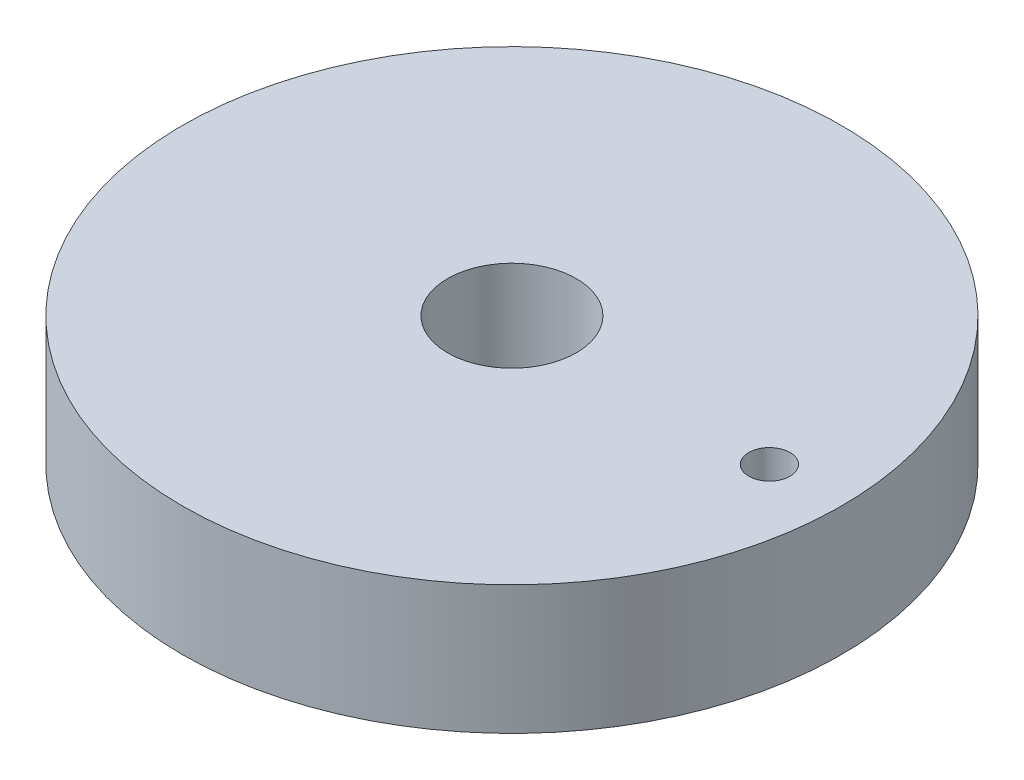
ISO-10303-21;
HEADER;
FILE_DESCRIPTION(('STEP AP214'),'2;1');
FILE_NAME('part.step','',(''),(''),'','','');
FILE_SCHEMA(('AUTOMOTIVE_DESIGN { 1 0 10303 214 1 1 1 1 }'));
ENDSEC;
DATA;
#1=APPLICATION_CONTEXT('core data for automotive mechanical design processes');
#2=APPLICATION_PROTOCOL_DEFINITION('international standard','automotive_design',2000,#1);
#3=PRODUCT_CONTEXT('',#1,'mechanical');
#4=PRODUCT('Part','Part','',(#3));
#5=PRODUCT_RELATED_PRODUCT_CATEGORY('part','',(#4));
#6=PRODUCT_DEFINITION_FORMATION('','',#4);
#7=PRODUCT_DEFINITION_CONTEXT('part definition',#1,'design');
#8=PRODUCT_DEFINITION('design','',#6,#7);
#9=PRODUCT_DEFINITION_SHAPE('','',#8);
#10=(LENGTH_UNIT() NAMED_UNIT(*) SI_UNIT(.MILLI.,.METRE.));
#11=(NAMED_UNIT(*) PLANE_ANGLE_UNIT() SI_UNIT($,.RADIAN.));
#12=(NAMED_UNIT(*) SI_UNIT($,.STERADIAN.) SOLID_ANGLE_UNIT());
#13=UNCERTAINTY_MEASURE_WITH_UNIT(LENGTH_MEASURE(1.E-05),#10,'distance_accuracy_value','');
#14=(GEOMETRIC_REPRESENTATION_CONTEXT(3) GLOBAL_UNCERTAINTY_ASSIGNED_CONTEXT((#13)) GLOBAL_UNIT_ASSIGNED_CONTEXT((#10,
#11,#12)) REPRESENTATION_CONTEXT('',''));
#15=CARTESIAN_POINT('',(0.,0.,0.));
#16=DIRECTION('',(0.,0.,1.));
#17=DIRECTION('',(1.,0.,0.));
#18=AXIS2_PLACEMENT_3D('',#15,#16,#17);
#19=CARTESIAN_POINT('',(0.,10.,0.));
#20=DIRECTION('',(0.,1.,0.));
#21=DIRECTION('',(0.,0.,1.));
#22=AXIS2_PLACEMENT_3D('',#19,#20,#21);
#23=PLANE('',#22);
#24=CARTESIAN_POINT('',(20.,10.,0.));
#25=DIRECTION('',(0.,1.,0.));
#26=DIRECTION('',(0.,0.,1.));
#27=AXIS2_PLACEMENT_3D('',#24,#25,#26);
#28=CIRCLE('',#27,1.6);
#29=CARTESIAN_POINT('',(20.,10.,1.6));
#30=VERTEX_POINT('',#29);
#31=EDGE_CURVE('E50',#30,#30,#28,.T.);
#32=ORIENTED_EDGE('',*,*,#31,.F.);
#33=EDGE_LOOP('',(#32));
#34=FACE_BOUND('',#33,.T.);
#35=CARTESIAN_POINT('',(0.,10.,0.));
#36=DIRECTION('',(0.,1.,0.));
#37=DIRECTION('',(0.,0.,1.));
#38=AXIS2_PLACEMENT_3D('',#35,#36,#37);
#39=CIRCLE('',#38,25.6);
#40=CARTESIAN_POINT('',(0.,10.,25.6));
#41=VERTEX_POINT('',#40);
#42=EDGE_CURVE('E10',#41,#41,#39,.T.);
#43=ORIENTED_EDGE('',*,*,#42,.T.);
#44=EDGE_LOOP('',(#43));
#45=FACE_BOUND('',#44,.T.);
#46=CARTESIAN_POINT('',(0.,10.,0.));
#47=DIRECTION('',(0.,1.,0.));
#48=DIRECTION('',(0.,0.,1.));
#49=AXIS2_PLACEMENT_3D('',#46,#47,#48);
#50=CIRCLE('',#49,5.);
#51=CARTESIAN_POINT('',(0.,10.,5.));
#52=VERTEX_POINT('',#51);
#53=EDGE_CURVE('E56',#52,#52,#50,.T.);
#54=ORIENTED_EDGE('',*,*,#53,.F.);
#55=EDGE_LOOP('',(#54));
#56=FACE_BOUND('',#55,.T.);
#57=ADVANCED_FACE('F37',(#34,#45,#56),#23,.T.);
#58=CARTESIAN_POINT('',(0.,0.,0.));
#59=DIRECTION('',(0.,1.,0.));
#60=DIRECTION('',(0.,0.,1.));
#61=AXIS2_PLACEMENT_3D('',#58,#59,#60);
#62=PLANE('',#61);
#63=CARTESIAN_POINT('',(0.,0.,0.));
#64=DIRECTION('',(0.,1.,0.));
#65=DIRECTION('',(0.,0.,1.));
#66=AXIS2_PLACEMENT_3D('',#63,#64,#65);
#67=CIRCLE('',#66,25.6);
#68=CARTESIAN_POINT('',(0.,0.,25.6));
#69=VERTEX_POINT('',#68);
#70=EDGE_CURVE('E41',#69,#69,#67,.T.);
#71=ORIENTED_EDGE('',*,*,#70,.F.);
#72=EDGE_LOOP('',(#71));
#73=FACE_BOUND('',#72,.T.);
#74=CARTESIAN_POINT('',(20.,0.,0.));
#75=DIRECTION('',(0.,1.,0.));
#76=DIRECTION('',(0.,0.,1.));
#77=AXIS2_PLACEMENT_3D('',#74,#75,#76);
#78=CIRCLE('',#77,1.6);
#79=CARTESIAN_POINT('',(20.,0.,1.6));
#80=VERTEX_POINT('',#79);
#81=EDGE_CURVE('E52',#80,#80,#78,.T.);
#82=ORIENTED_EDGE('',*,*,#81,.T.);
#83=EDGE_LOOP('',(#82));
#84=FACE_BOUND('',#83,.T.);
#85=CARTESIAN_POINT('',(0.,0.,0.));
#86=DIRECTION('',(0.,1.,0.));
#87=DIRECTION('',(0.,0.,1.));
#88=AXIS2_PLACEMENT_3D('',#85,#86,#87);
#89=CIRCLE('',#88,5.);
#90=CARTESIAN_POINT('',(0.,0.,5.));
#91=VERTEX_POINT('',#90);
#92=EDGE_CURVE('E60',#91,#91,#89,.T.);
#93=ORIENTED_EDGE('',*,*,#92,.T.);
#94=EDGE_LOOP('',(#93));
#95=FACE_BOUND('',#94,.T.);
#96=ADVANCED_FACE('F72',(#73,#84,#95),#62,.F.);
#97=CARTESIAN_POINT('',(0.,10.,0.));
#98=DIRECTION('',(0.,-1.,0.));
#99=DIRECTION('',(0.,0.,-1.));
#100=AXIS2_PLACEMENT_3D('',#97,#98,#99);
#101=CYLINDRICAL_SURFACE('',#100,25.6);
#102=ORIENTED_EDGE('',*,*,#42,.F.);
#103=EDGE_LOOP('',(#102));
#104=FACE_BOUND('',#103,.T.);
#105=ORIENTED_EDGE('',*,*,#70,.T.);
#106=EDGE_LOOP('',(#105));
#107=FACE_BOUND('',#106,.T.);
#108=ADVANCED_FACE('F39',(#104,#107),#101,.T.);
#109=CARTESIAN_POINT('',(20.,10.,0.));
#110=DIRECTION('',(0.,-1.,0.));
#111=DIRECTION('',(0.,0.,-1.));
#112=AXIS2_PLACEMENT_3D('',#109,#110,#111);
#113=CYLINDRICAL_SURFACE('',#112,1.6);
#114=ORIENTED_EDGE('',*,*,#31,.T.);
#115=EDGE_LOOP('',(#114));
#116=FACE_BOUND('',#115,.T.);
#117=ORIENTED_EDGE('',*,*,#81,.F.);
#118=EDGE_LOOP('',(#117));
#119=FACE_BOUND('',#118,.T.);
#120=ADVANCED_FACE('F81',(#116,#119),#113,.F.);
#121=CARTESIAN_POINT('',(0.,10.,0.));
#122=DIRECTION('',(0.,-1.,0.));
#123=DIRECTION('',(0.,0.,-1.));
#124=AXIS2_PLACEMENT_3D('',#121,#122,#123);
#125=CYLINDRICAL_SURFACE('',#124,5.);
#126=ORIENTED_EDGE('',*,*,#53,.T.);
#127=EDGE_LOOP('',(#126));
#128=FACE_BOUND('',#127,.T.);
#129=ORIENTED_EDGE('',*,*,#92,.F.);
#130=EDGE_LOOP('',(#129));
#131=FACE_BOUND('',#130,.T.);
#132=ADVANCED_FACE('F68',(#128,#131),#125,.F.);
#133=CLOSED_SHELL('',(#57,#96,#108,#120,#132));
#134=MANIFOLD_SOLID_BREP('B2',#133);
#135=ADVANCED_BREP_SHAPE_REPRESENTATION('',(#18,#134),#14);
#136=SHAPE_DEFINITION_REPRESENTATION(#9,#135);
ENDSEC;
END-ISO-10303-21;
